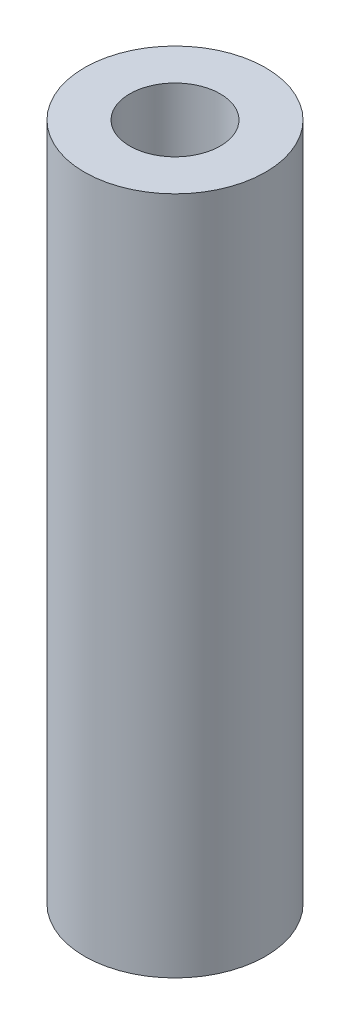
ISO-10303-21;
HEADER;
FILE_DESCRIPTION(('STEP AP214'),'2;1');
FILE_NAME('part.step','',(''),(''),'','','');
FILE_SCHEMA(('AUTOMOTIVE_DESIGN { 1 0 10303 214 1 1 1 1 }'));
ENDSEC;
DATA;
#1=APPLICATION_CONTEXT('core data for automotive mechanical design processes');
#2=APPLICATION_PROTOCOL_DEFINITION('international standard','automotive_design',2000,#1);
#3=PRODUCT_CONTEXT('',#1,'mechanical');
#4=PRODUCT('Part','Part','',(#3));
#5=PRODUCT_RELATED_PRODUCT_CATEGORY('part','',(#4));
#6=PRODUCT_DEFINITION_FORMATION('','',#4);
#7=PRODUCT_DEFINITION_CONTEXT('part definition',#1,'design');
#8=PRODUCT_DEFINITION('design','',#6,#7);
#9=PRODUCT_DEFINITION_SHAPE('','',#8);
#10=(LENGTH_UNIT() NAMED_UNIT(*) SI_UNIT(.MILLI.,.METRE.));
#11=(NAMED_UNIT(*) PLANE_ANGLE_UNIT() SI_UNIT($,.RADIAN.));
#12=(NAMED_UNIT(*) SI_UNIT($,.STERADIAN.) SOLID_ANGLE_UNIT());
#13=UNCERTAINTY_MEASURE_WITH_UNIT(LENGTH_MEASURE(1.E-05),#10,'distance_accuracy_value','');
#14=(GEOMETRIC_REPRESENTATION_CONTEXT(3) GLOBAL_UNCERTAINTY_ASSIGNED_CONTEXT((#13)) GLOBAL_UNIT_ASSIGNED_CONTEXT((#10,
#11,#12)) REPRESENTATION_CONTEXT('',''));
#15=CARTESIAN_POINT('',(0.,0.,0.));
#16=DIRECTION('',(0.,0.,1.));
#17=DIRECTION('',(1.,0.,0.));
#18=AXIS2_PLACEMENT_3D('',#15,#16,#17);
#19=CARTESIAN_POINT('',(0.,38.1,0.));
#20=DIRECTION('',(0.,1.,0.));
#21=DIRECTION('',(0.,0.,1.));
#22=AXIS2_PLACEMENT_3D('',#19,#20,#21);
#23=PLANE('',#22);
#24=CARTESIAN_POINT('',(0.,38.1,0.));
#25=DIRECTION('',(0.,1.,0.));
#26=DIRECTION('',(0.,0.,1.));
#27=AXIS2_PLACEMENT_3D('',#24,#25,#26);
#28=CIRCLE('',#27,5.08);
#29=CARTESIAN_POINT('',(0.,38.1,-5.08));
#30=VERTEX_POINT('',#29);
#31=EDGE_CURVE('E10',#30,#30,#28,.T.);
#32=ORIENTED_EDGE('',*,*,#31,.T.);
#33=EDGE_LOOP('',(#32));
#34=FACE_BOUND('',#33,.T.);
#35=CARTESIAN_POINT('',(0.,38.1,0.));
#36=DIRECTION('',(0.,1.,0.));
#37=DIRECTION('',(0.,0.,1.));
#38=AXIS2_PLACEMENT_3D('',#35,#36,#37);
#39=CIRCLE('',#38,2.54);
#40=CARTESIAN_POINT('',(0.,38.1,-2.54));
#41=VERTEX_POINT('',#40);
#42=EDGE_CURVE('E44',#41,#41,#39,.T.);
#43=ORIENTED_EDGE('',*,*,#42,.F.);
#44=EDGE_LOOP('',(#43));
#45=FACE_BOUND('',#44,.T.);
#46=ADVANCED_FACE('F33',(#34,#45),#23,.T.);
#47=CARTESIAN_POINT('',(0.,0.,0.));
#48=DIRECTION('',(0.,1.,0.));
#49=DIRECTION('',(0.,0.,1.));
#50=AXIS2_PLACEMENT_3D('',#47,#48,#49);
#51=PLANE('',#50);
#52=CARTESIAN_POINT('',(0.,0.,0.));
#53=DIRECTION('',(0.,1.,0.));
#54=DIRECTION('',(0.,0.,1.));
#55=AXIS2_PLACEMENT_3D('',#52,#53,#54);
#56=CIRCLE('',#55,5.08);
#57=CARTESIAN_POINT('',(0.,0.,-5.08));
#58=VERTEX_POINT('',#57);
#59=EDGE_CURVE('E37',#58,#58,#56,.T.);
#60=ORIENTED_EDGE('',*,*,#59,.F.);
#61=EDGE_LOOP('',(#60));
#62=FACE_BOUND('',#61,.T.);
#63=CARTESIAN_POINT('',(0.,0.,0.));
#64=DIRECTION('',(0.,1.,0.));
#65=DIRECTION('',(0.,0.,1.));
#66=AXIS2_PLACEMENT_3D('',#63,#64,#65);
#67=CIRCLE('',#66,2.54);
#68=CARTESIAN_POINT('',(0.,0.,-2.54));
#69=VERTEX_POINT('',#68);
#70=EDGE_CURVE('E46',#69,#69,#67,.T.);
#71=ORIENTED_EDGE('',*,*,#70,.T.);
#72=EDGE_LOOP('',(#71));
#73=FACE_BOUND('',#72,.T.);
#74=ADVANCED_FACE('F56',(#62,#73),#51,.F.);
#75=CARTESIAN_POINT('',(0.,38.1,0.));
#76=DIRECTION('',(0.,-1.,0.));
#77=DIRECTION('',(0.,0.,-1.));
#78=AXIS2_PLACEMENT_3D('',#75,#76,#77);
#79=CYLINDRICAL_SURFACE('',#78,5.08);
#80=CARTESIAN_POINT('',(0.,38.1,-5.08));
#81=CARTESIAN_POINT('',(0.,37.703125,-5.08));
#82=CARTESIAN_POINT('',(0.,37.30625,-5.08));
#83=CARTESIAN_POINT('',(0.,36.5125,-5.08));
#84=CARTESIAN_POINT('',(0.,36.115625,-5.08));
#85=CARTESIAN_POINT('',(0.,35.321875,-5.08));
#86=CARTESIAN_POINT('',(0.,34.925,-5.08));
#87=CARTESIAN_POINT('',(0.,34.13125,-5.08));
#88=CARTESIAN_POINT('',(0.,33.734375,-5.08));
#89=CARTESIAN_POINT('',(0.,32.940625,-5.08));
#90=CARTESIAN_POINT('',(0.,32.54375,-5.08));
#91=CARTESIAN_POINT('',(0.,31.75,-5.08));
#92=CARTESIAN_POINT('',(0.,31.353125,-5.08));
#93=CARTESIAN_POINT('',(0.,30.559375,-5.08));
#94=CARTESIAN_POINT('',(0.,30.1625,-5.08));
#95=CARTESIAN_POINT('',(0.,29.36875,-5.08));
#96=CARTESIAN_POINT('',(0.,28.971875,-5.08));
#97=CARTESIAN_POINT('',(0.,28.178125,-5.08));
#98=CARTESIAN_POINT('',(0.,27.78125,-5.08));
#99=CARTESIAN_POINT('',(0.,26.9875,-5.08));
#100=CARTESIAN_POINT('',(0.,26.590625,-5.08));
#101=CARTESIAN_POINT('',(0.,25.796875,-5.08));
#102=CARTESIAN_POINT('',(0.,25.4,-5.08));
#103=CARTESIAN_POINT('',(0.,24.60625,-5.08));
#104=CARTESIAN_POINT('',(0.,24.209375,-5.08));
#105=CARTESIAN_POINT('',(0.,23.415625,-5.08));
#106=CARTESIAN_POINT('',(0.,23.01875,-5.08));
#107=CARTESIAN_POINT('',(0.,22.225,-5.08));
#108=CARTESIAN_POINT('',(0.,21.828125,-5.08));
#109=CARTESIAN_POINT('',(0.,21.034375,-5.08));
#110=CARTESIAN_POINT('',(0.,20.6375,-5.08));
#111=CARTESIAN_POINT('',(0.,19.84375,-5.08));
#112=CARTESIAN_POINT('',(0.,19.446875,-5.08));
#113=CARTESIAN_POINT('',(0.,18.653125,-5.08));
#114=CARTESIAN_POINT('',(0.,18.25625,-5.08));
#115=CARTESIAN_POINT('',(0.,17.4625,-5.08));
#116=CARTESIAN_POINT('',(0.,17.065625,-5.08));
#117=CARTESIAN_POINT('',(0.,16.271875,-5.08));
#118=CARTESIAN_POINT('',(0.,15.875,-5.08));
#119=CARTESIAN_POINT('',(0.,15.08125,-5.08));
#120=CARTESIAN_POINT('',(0.,14.684375,-5.08));
#121=CARTESIAN_POINT('',(0.,13.890625,-5.08));
#122=CARTESIAN_POINT('',(0.,13.49375,-5.08));
#123=CARTESIAN_POINT('',(0.,12.7,-5.08));
#124=CARTESIAN_POINT('',(0.,12.303125,-5.08));
#125=CARTESIAN_POINT('',(0.,11.509375,-5.08));
#126=CARTESIAN_POINT('',(0.,11.1125,-5.08));
#127=CARTESIAN_POINT('',(0.,10.31875,-5.08));
#128=CARTESIAN_POINT('',(0.,9.921875,-5.08));
#129=CARTESIAN_POINT('',(0.,9.128125,-5.08));
#130=CARTESIAN_POINT('',(0.,8.73125,-5.08));
#131=CARTESIAN_POINT('',(0.,7.9375,-5.08));
#132=CARTESIAN_POINT('',(0.,7.540625,-5.08));
#133=CARTESIAN_POINT('',(0.,6.746875,-5.08));
#134=CARTESIAN_POINT('',(0.,6.35,-5.08));
#135=CARTESIAN_POINT('',(0.,5.55625,-5.08));
#136=CARTESIAN_POINT('',(0.,5.159375,-5.08));
#137=CARTESIAN_POINT('',(0.,4.365625,-5.08));
#138=CARTESIAN_POINT('',(0.,3.96875,-5.08));
#139=CARTESIAN_POINT('',(0.,3.175,-5.08));
#140=CARTESIAN_POINT('',(0.,2.778125,-5.08));
#141=CARTESIAN_POINT('',(0.,1.984375,-5.08));
#142=CARTESIAN_POINT('',(0.,1.5875,-5.08));
#143=CARTESIAN_POINT('',(0.,0.79375,-5.08));
#144=CARTESIAN_POINT('',(0.,0.396875,-5.08));
#145=CARTESIAN_POINT('',(0.,0.,-5.08));
#146=B_SPLINE_CURVE_WITH_KNOTS('',3,(#80,#81,#82,#83,#84,#85,#86,#87,#88,#89,#90,#91,#92,#93,
#94,#95,#96,#97,#98,#99,#100,#101,#102,#103,#104,#105,#106,#107,#108,#109,#110,#111,#112,#113,
#114,#115,#116,#117,#118,#119,#120,#121,#122,#123,#124,#125,#126,#127,#128,#129,#130,#131,#132,
#133,#134,#135,#136,#137,#138,#139,#140,#141,#142,#143,#144,#145),.UNSPECIFIED.,.F.,.F.,(4,2,2,
2,2,2,2,2,2,2,2,2,2,2,2,2,2,2,2,2,2,2,2,2,2,2,2,2,2,2,2,2,4),(0.,1.19062499999999,
2.38124999999999,3.571875,4.7625,5.953125,7.14375,8.33437499999999,9.525,10.715625,11.90625,
13.096875,14.2875,15.478125,16.66875,17.859375,19.05,20.240625,21.43125,22.621875,23.8125,
25.003125,26.19375,27.384375,28.575,29.765625,30.95625,32.146875,33.3375,34.528125,35.71875,
36.909375,38.1),.UNSPECIFIED.);
#147=EDGE_CURVE('BSEAM35',#30,#58,#146,.T.);
#148=ORIENTED_EDGE('',*,*,#31,.F.);
#149=ORIENTED_EDGE('',*,*,#59,.T.);
#150=ORIENTED_EDGE('',*,*,#147,.T.);
#151=ORIENTED_EDGE('',*,*,#147,.F.);
#152=EDGE_LOOP('',(#148,#150,#149,#151));
#153=FACE_BOUND('',#152,.T.);
#154=ADVANCED_FACE('F35',(#153),#79,.T.);
#155=CARTESIAN_POINT('',(0.,38.1,0.));
#156=DIRECTION('',(0.,-1.,0.));
#157=DIRECTION('',(0.,0.,-1.));
#158=AXIS2_PLACEMENT_3D('',#155,#156,#157);
#159=CYLINDRICAL_SURFACE('',#158,2.54);
#160=CARTESIAN_POINT('',(0.,38.1,-2.54));
#161=CARTESIAN_POINT('',(0.,37.703125,-2.54));
#162=CARTESIAN_POINT('',(0.,37.30625,-2.54));
#163=CARTESIAN_POINT('',(0.,36.5125,-2.54));
#164=CARTESIAN_POINT('',(0.,36.115625,-2.54));
#165=CARTESIAN_POINT('',(0.,35.321875,-2.54));
#166=CARTESIAN_POINT('',(0.,34.925,-2.54));
#167=CARTESIAN_POINT('',(0.,34.13125,-2.54));
#168=CARTESIAN_POINT('',(0.,33.734375,-2.54));
#169=CARTESIAN_POINT('',(0.,32.940625,-2.54));
#170=CARTESIAN_POINT('',(0.,32.54375,-2.54));
#171=CARTESIAN_POINT('',(0.,31.75,-2.54));
#172=CARTESIAN_POINT('',(0.,31.353125,-2.54));
#173=CARTESIAN_POINT('',(0.,30.559375,-2.54));
#174=CARTESIAN_POINT('',(0.,30.1625,-2.54));
#175=CARTESIAN_POINT('',(0.,29.36875,-2.54));
#176=CARTESIAN_POINT('',(0.,28.971875,-2.54));
#177=CARTESIAN_POINT('',(0.,28.178125,-2.54));
#178=CARTESIAN_POINT('',(0.,27.78125,-2.54));
#179=CARTESIAN_POINT('',(0.,26.9875,-2.54));
#180=CARTESIAN_POINT('',(0.,26.590625,-2.54));
#181=CARTESIAN_POINT('',(0.,25.796875,-2.54));
#182=CARTESIAN_POINT('',(0.,25.4,-2.54));
#183=CARTESIAN_POINT('',(0.,24.60625,-2.54));
#184=CARTESIAN_POINT('',(0.,24.209375,-2.54));
#185=CARTESIAN_POINT('',(0.,23.415625,-2.54));
#186=CARTESIAN_POINT('',(0.,23.01875,-2.54));
#187=CARTESIAN_POINT('',(0.,22.225,-2.54));
#188=CARTESIAN_POINT('',(0.,21.828125,-2.54));
#189=CARTESIAN_POINT('',(0.,21.034375,-2.54));
#190=CARTESIAN_POINT('',(0.,20.6375,-2.54));
#191=CARTESIAN_POINT('',(0.,19.84375,-2.54));
#192=CARTESIAN_POINT('',(0.,19.446875,-2.54));
#193=CARTESIAN_POINT('',(0.,18.653125,-2.54));
#194=CARTESIAN_POINT('',(0.,18.25625,-2.54));
#195=CARTESIAN_POINT('',(0.,17.4625,-2.54));
#196=CARTESIAN_POINT('',(0.,17.065625,-2.54));
#197=CARTESIAN_POINT('',(0.,16.271875,-2.54));
#198=CARTESIAN_POINT('',(0.,15.875,-2.54));
#199=CARTESIAN_POINT('',(0.,15.08125,-2.54));
#200=CARTESIAN_POINT('',(0.,14.684375,-2.54));
#201=CARTESIAN_POINT('',(0.,13.890625,-2.54));
#202=CARTESIAN_POINT('',(0.,13.49375,-2.54));
#203=CARTESIAN_POINT('',(0.,12.7,-2.54));
#204=CARTESIAN_POINT('',(0.,12.303125,-2.54));
#205=CARTESIAN_POINT('',(0.,11.509375,-2.54));
#206=CARTESIAN_POINT('',(0.,11.1125,-2.54));
#207=CARTESIAN_POINT('',(0.,10.31875,-2.54));
#208=CARTESIAN_POINT('',(0.,9.921875,-2.54));
#209=CARTESIAN_POINT('',(0.,9.128125,-2.54));
#210=CARTESIAN_POINT('',(0.,8.73125,-2.54));
#211=CARTESIAN_POINT('',(0.,7.9375,-2.54));
#212=CARTESIAN_POINT('',(0.,7.540625,-2.54));
#213=CARTESIAN_POINT('',(0.,6.746875,-2.54));
#214=CARTESIAN_POINT('',(0.,6.35,-2.54));
#215=CARTESIAN_POINT('',(0.,5.55625,-2.54));
#216=CARTESIAN_POINT('',(0.,5.159375,-2.54));
#217=CARTESIAN_POINT('',(0.,4.365625,-2.54));
#218=CARTESIAN_POINT('',(0.,3.96875,-2.54));
#219=CARTESIAN_POINT('',(0.,3.175,-2.54));
#220=CARTESIAN_POINT('',(0.,2.778125,-2.54));
#221=CARTESIAN_POINT('',(0.,1.984375,-2.54));
#222=CARTESIAN_POINT('',(0.,1.5875,-2.54));
#223=CARTESIAN_POINT('',(0.,0.79375,-2.54));
#224=CARTESIAN_POINT('',(0.,0.396875,-2.54));
#225=CARTESIAN_POINT('',(0.,0.,-2.54));
#226=B_SPLINE_CURVE_WITH_KNOTS('',3,(#160,#161,#162,#163,#164,#165,#166,#167,#168,#169,#170,
#171,#172,#173,#174,#175,#176,#177,#178,#179,#180,#181,#182,#183,#184,#185,#186,#187,#188,#189,
#190,#191,#192,#193,#194,#195,#196,#197,#198,#199,#200,#201,#202,#203,#204,#205,#206,#207,#208,
#209,#210,#211,#212,#213,#214,#215,#216,#217,#218,#219,#220,#221,#222,#223,#224,#225),
.UNSPECIFIED.,.F.,.F.,(4,2,2,2,2,2,2,2,2,2,2,2,2,2,2,2,2,2,2,2,2,2,2,2,2,2,2,2,2,2,2,2,4),(0.,
1.19062499999999,2.38124999999999,3.571875,4.7625,5.953125,7.14375,8.33437499999999,9.525,
10.715625,11.90625,13.096875,14.2875,15.478125,16.66875,17.859375,19.05,20.240625,21.43125,
22.621875,23.8125,25.003125,26.19375,27.384375,28.575,29.765625,30.95625,32.146875,33.3375,
34.528125,35.71875,36.909375,38.1),.UNSPECIFIED.);
#227=EDGE_CURVE('BSEAM52',#41,#69,#226,.T.);
#228=ORIENTED_EDGE('',*,*,#42,.T.);
#229=ORIENTED_EDGE('',*,*,#70,.F.);
#230=ORIENTED_EDGE('',*,*,#227,.T.);
#231=ORIENTED_EDGE('',*,*,#227,.F.);
#232=EDGE_LOOP('',(#228,#230,#229,#231));
#233=FACE_BOUND('',#232,.T.);
#234=ADVANCED_FACE('F52',(#233),#159,.F.);
#235=CLOSED_SHELL('',(#46,#74,#154,#234));
#236=MANIFOLD_SOLID_BREP('B2',#235);
#237=ADVANCED_BREP_SHAPE_REPRESENTATION('',(#18,#236),#14);
#238=SHAPE_DEFINITION_REPRESENTATION(#9,#237);
ENDSEC;
END-ISO-10303-21;
